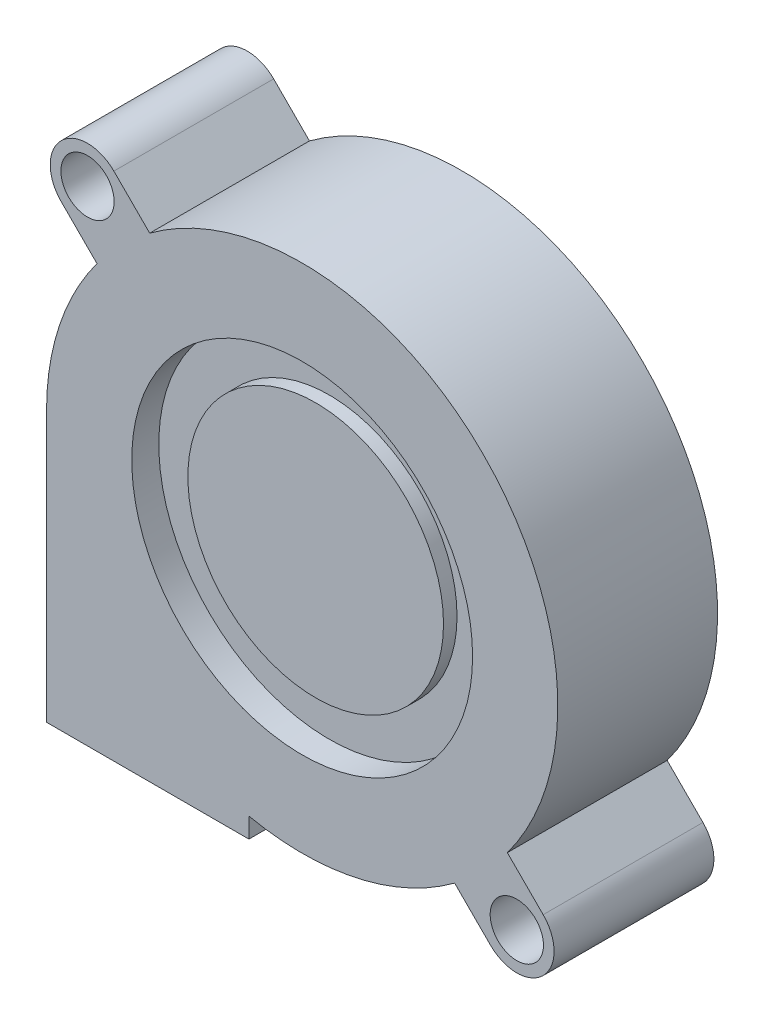
ISO-10303-21;
HEADER;
FILE_DESCRIPTION(('STEP AP214'),'2;1');
FILE_NAME('part.step','',(''),(''),'','','');
FILE_SCHEMA(('AUTOMOTIVE_DESIGN { 1 0 10303 214 1 1 1 1 }'));
ENDSEC;
DATA;
#1=APPLICATION_CONTEXT('core data for automotive mechanical design processes');
#2=APPLICATION_PROTOCOL_DEFINITION('international standard','automotive_design',2000,#1);
#3=PRODUCT_CONTEXT('',#1,'mechanical');
#4=PRODUCT('Part','Part','',(#3));
#5=PRODUCT_RELATED_PRODUCT_CATEGORY('part','',(#4));
#6=PRODUCT_DEFINITION_FORMATION('','',#4);
#7=PRODUCT_DEFINITION_CONTEXT('part definition',#1,'design');
#8=PRODUCT_DEFINITION('design','',#6,#7);
#9=PRODUCT_DEFINITION_SHAPE('','',#8);
#10=(LENGTH_UNIT() NAMED_UNIT(*) SI_UNIT(.MILLI.,.METRE.));
#11=(NAMED_UNIT(*) PLANE_ANGLE_UNIT() SI_UNIT($,.RADIAN.));
#12=(NAMED_UNIT(*) SI_UNIT($,.STERADIAN.) SOLID_ANGLE_UNIT());
#13=UNCERTAINTY_MEASURE_WITH_UNIT(LENGTH_MEASURE(1.E-05),#10,'distance_accuracy_value','');
#14=(GEOMETRIC_REPRESENTATION_CONTEXT(3) GLOBAL_UNCERTAINTY_ASSIGNED_CONTEXT((#13)) GLOBAL_UNIT_ASSIGNED_CONTEXT((#10,
#11,#12)) REPRESENTATION_CONTEXT('',''));
#15=CARTESIAN_POINT('',(0.,0.,0.));
#16=DIRECTION('',(0.,0.,1.));
#17=DIRECTION('',(1.,0.,0.));
#18=AXIS2_PLACEMENT_3D('',#15,#16,#17);
#19=CARTESIAN_POINT('',(0.,0.,12.46));
#20=DIRECTION('',(0.,0.,1.));
#21=DIRECTION('',(1.,0.,0.));
#22=AXIS2_PLACEMENT_3D('',#19,#20,#21);
#23=CYLINDRICAL_SURFACE('',#22,12.);
#24=CARTESIAN_POINT('',(0.,0.,12.46));
#25=DIRECTION('',(0.,0.,1.));
#26=DIRECTION('',(1.,0.,0.));
#27=AXIS2_PLACEMENT_3D('',#24,#25,#26);
#28=CIRCLE('',#27,12.);
#29=CARTESIAN_POINT('',(12.,0.,12.46));
#30=VERTEX_POINT('',#29);
#31=EDGE_CURVE('E314',#30,#30,#28,.T.);
#32=CARTESIAN_POINT('',(0.,0.,13.73));
#33=DIRECTION('',(0.,0.,1.));
#34=DIRECTION('',(1.,0.,0.));
#35=AXIS2_PLACEMENT_3D('',#32,#33,#34);
#36=CIRCLE('',#35,12.);
#37=CARTESIAN_POINT('',(12.,0.,13.73));
#38=VERTEX_POINT('',#37);
#39=EDGE_CURVE('E319',#38,#38,#36,.T.);
#40=CARTESIAN_POINT('',(12.,0.,12.46));
#41=CARTESIAN_POINT('',(12.,0.,12.4732291666667));
#42=CARTESIAN_POINT('',(12.,0.,12.4864583333333));
#43=CARTESIAN_POINT('',(12.,0.,12.5129166666667));
#44=CARTESIAN_POINT('',(12.,0.,12.5261458333333));
#45=CARTESIAN_POINT('',(12.,0.,12.5526041666667));
#46=CARTESIAN_POINT('',(12.,0.,12.5658333333333));
#47=CARTESIAN_POINT('',(12.,0.,12.5922916666667));
#48=CARTESIAN_POINT('',(12.,0.,12.6055208333333));
#49=CARTESIAN_POINT('',(12.,0.,12.6319791666667));
#50=CARTESIAN_POINT('',(12.,0.,12.6452083333333));
#51=CARTESIAN_POINT('',(12.,0.,12.6716666666667));
#52=CARTESIAN_POINT('',(12.,0.,12.6848958333333));
#53=CARTESIAN_POINT('',(12.,0.,12.7113541666667));
#54=CARTESIAN_POINT('',(12.,0.,12.7245833333333));
#55=CARTESIAN_POINT('',(12.,0.,12.7510416666667));
#56=CARTESIAN_POINT('',(12.,0.,12.7642708333333));
#57=CARTESIAN_POINT('',(12.,0.,12.7907291666667));
#58=CARTESIAN_POINT('',(12.,0.,12.8039583333333));
#59=CARTESIAN_POINT('',(12.,0.,12.8304166666667));
#60=CARTESIAN_POINT('',(12.,0.,12.8436458333333));
#61=CARTESIAN_POINT('',(12.,0.,12.8701041666667));
#62=CARTESIAN_POINT('',(12.,0.,12.8833333333333));
#63=CARTESIAN_POINT('',(12.,0.,12.9097916666667));
#64=CARTESIAN_POINT('',(12.,0.,12.9230208333333));
#65=CARTESIAN_POINT('',(12.,0.,12.9494791666667));
#66=CARTESIAN_POINT('',(12.,0.,12.9627083333333));
#67=CARTESIAN_POINT('',(12.,0.,12.9891666666667));
#68=CARTESIAN_POINT('',(12.,0.,13.0023958333333));
#69=CARTESIAN_POINT('',(12.,0.,13.0288541666667));
#70=CARTESIAN_POINT('',(12.,0.,13.0420833333333));
#71=CARTESIAN_POINT('',(12.,0.,13.0685416666667));
#72=CARTESIAN_POINT('',(12.,0.,13.0817708333333));
#73=CARTESIAN_POINT('',(12.,0.,13.1082291666667));
#74=CARTESIAN_POINT('',(12.,0.,13.1214583333333));
#75=CARTESIAN_POINT('',(12.,0.,13.1479166666667));
#76=CARTESIAN_POINT('',(12.,0.,13.1611458333333));
#77=CARTESIAN_POINT('',(12.,0.,13.1876041666667));
#78=CARTESIAN_POINT('',(12.,0.,13.2008333333333));
#79=CARTESIAN_POINT('',(12.,0.,13.2272916666667));
#80=CARTESIAN_POINT('',(12.,0.,13.2405208333333));
#81=CARTESIAN_POINT('',(12.,0.,13.2669791666667));
#82=CARTESIAN_POINT('',(12.,0.,13.2802083333333));
#83=CARTESIAN_POINT('',(12.,0.,13.3066666666667));
#84=CARTESIAN_POINT('',(12.,0.,13.3198958333333));
#85=CARTESIAN_POINT('',(12.,0.,13.3463541666667));
#86=CARTESIAN_POINT('',(12.,0.,13.3595833333333));
#87=CARTESIAN_POINT('',(12.,0.,13.3860416666667));
#88=CARTESIAN_POINT('',(12.,0.,13.3992708333333));
#89=CARTESIAN_POINT('',(12.,0.,13.4257291666667));
#90=CARTESIAN_POINT('',(12.,0.,13.4389583333333));
#91=CARTESIAN_POINT('',(12.,0.,13.4654166666667));
#92=CARTESIAN_POINT('',(12.,0.,13.4786458333333));
#93=CARTESIAN_POINT('',(12.,0.,13.5051041666667));
#94=CARTESIAN_POINT('',(12.,0.,13.5183333333333));
#95=CARTESIAN_POINT('',(12.,0.,13.5447916666667));
#96=CARTESIAN_POINT('',(12.,0.,13.5580208333333));
#97=CARTESIAN_POINT('',(12.,0.,13.5844791666667));
#98=CARTESIAN_POINT('',(12.,0.,13.5977083333333));
#99=CARTESIAN_POINT('',(12.,0.,13.6241666666667));
#100=CARTESIAN_POINT('',(12.,0.,13.6373958333333));
#101=CARTESIAN_POINT('',(12.,0.,13.6638541666667));
#102=CARTESIAN_POINT('',(12.,0.,13.6770833333333));
#103=CARTESIAN_POINT('',(12.,0.,13.7035416666667));
#104=CARTESIAN_POINT('',(12.,0.,13.7167708333333));
#105=CARTESIAN_POINT('',(12.,0.,13.73));
#106=B_SPLINE_CURVE_WITH_KNOTS('',3,(#40,#41,#42,#43,#44,#45,#46,#47,#48,#49,#50,#51,#52,#53,
#54,#55,#56,#57,#58,#59,#60,#61,#62,#63,#64,#65,#66,#67,#68,#69,#70,#71,#72,#73,#74,#75,#76,#77,
#78,#79,#80,#81,#82,#83,#84,#85,#86,#87,#88,#89,#90,#91,#92,#93,#94,#95,#96,#97,#98,#99,#100,
#101,#102,#103,#104,#105),.UNSPECIFIED.,.F.,.F.,(4,2,2,2,2,2,2,2,2,2,2,2,2,2,2,2,2,2,2,2,2,2,2,
2,2,2,2,2,2,2,2,2,4),(0.,0.0396874999999998,0.0793749999999996,0.119062499999999,
0.158749999999999,0.198437499999999,0.238124999999999,0.277812499999999,0.317499999999998,
0.357187499999998,0.396874999999998,0.436562499999998,0.476249999999998,0.515937499999997,
0.555624999999997,0.595312499999997,0.634999999999997,0.674687499999996,0.714374999999998,
0.754062499999998,0.793749999999998,0.833437499999997,0.873124999999997,0.912812499999997,
0.952499999999997,0.992187499999997,1.031875,1.0715625,1.11125,1.1509375,1.190625,1.2303125,
1.27),.UNSPECIFIED.);
#107=EDGE_CURVE('BSEAM37',#30,#38,#106,.T.);
#108=ORIENTED_EDGE('',*,*,#31,.T.);
#109=ORIENTED_EDGE('',*,*,#39,.F.);
#110=ORIENTED_EDGE('',*,*,#107,.T.);
#111=ORIENTED_EDGE('',*,*,#107,.F.);
#112=EDGE_LOOP('',(#108,#110,#109,#111));
#113=FACE_BOUND('',#112,.T.);
#114=ADVANCED_FACE('F37',(#113),#23,.T.);
#115=CARTESIAN_POINT('',(-20.1525432638166,20.1525432638166,15.));
#116=DIRECTION('',(0.,0.,-1.));
#117=DIRECTION('',(-1.,0.,0.));
#118=AXIS2_PLACEMENT_3D('',#115,#116,#117);
#119=CYLINDRICAL_SURFACE('',#118,3.5);
#120=CARTESIAN_POINT('',(-20.1525432638166,20.1525432638166,0.));
#121=DIRECTION('',(0.,0.,1.));
#122=DIRECTION('',(1.,0.,0.));
#123=AXIS2_PLACEMENT_3D('',#120,#121,#122);
#124=CIRCLE('',#123,3.5);
#125=CARTESIAN_POINT('',(-17.6776695296637,22.6274169979695,0.));
#126=VERTEX_POINT('',#125);
#127=CARTESIAN_POINT('',(-22.6274169979695,17.6776695296637,0.));
#128=VERTEX_POINT('',#127);
#129=EDGE_CURVE('E177',#126,#128,#124,.T.);
#130=ORIENTED_EDGE('',*,*,#129,.T.);
#131=DIRECTION('',(0.,0.,-1.));
#132=VECTOR('',#131,1.);
#133=CARTESIAN_POINT('',(-22.6274169979695,17.6776695296637,15.));
#134=LINE('',#133,#132);
#135=CARTESIAN_POINT('',(-22.6274169979695,17.6776695296637,15.));
#136=VERTEX_POINT('',#135);
#137=EDGE_CURVE('E11',#136,#128,#134,.T.);
#138=ORIENTED_EDGE('',*,*,#137,.F.);
#139=CARTESIAN_POINT('',(-20.1525432638166,20.1525432638166,15.));
#140=DIRECTION('',(0.,0.,1.));
#141=DIRECTION('',(1.,0.,0.));
#142=AXIS2_PLACEMENT_3D('',#139,#140,#141);
#143=CIRCLE('',#142,3.5);
#144=CARTESIAN_POINT('',(-17.6776695296637,22.6274169979695,15.));
#145=VERTEX_POINT('',#144);
#146=EDGE_CURVE('E207',#145,#136,#143,.T.);
#147=ORIENTED_EDGE('',*,*,#146,.F.);
#148=DIRECTION('',(0.,0.,-1.));
#149=VECTOR('',#148,1.);
#150=CARTESIAN_POINT('',(-17.6776695296637,22.6274169979695,15.));
#151=LINE('',#150,#149);
#152=EDGE_CURVE('E176',#145,#126,#151,.T.);
#153=ORIENTED_EDGE('',*,*,#152,.T.);
#154=EDGE_LOOP('',(#130,#138,#147,#153));
#155=FACE_BOUND('',#154,.T.);
#156=ADVANCED_FACE('F39',(#155),#119,.T.);
#157=CARTESIAN_POINT('',(-2.47487373415292,-2.47487373415292,15.));
#158=DIRECTION('',(0.707106781186547,0.707106781186547,0.));
#159=DIRECTION('',(-0.707106781186548,0.707106781186548,0.));
#160=AXIS2_PLACEMENT_3D('',#157,#158,#159);
#161=PLANE('',#160);
#162=DIRECTION('',(0.707106781186548,-0.707106781186548,0.));
#163=VECTOR('',#162,1.);
#164=CARTESIAN_POINT('',(-2.47487373415292,-2.47487373415292,0.));
#165=LINE('',#164,#163);
#166=CARTESIAN_POINT('',(-19.2640071245337,14.3142596562279,0.));
#167=VERTEX_POINT('',#166);
#168=EDGE_CURVE('E180',#128,#167,#165,.T.);
#169=ORIENTED_EDGE('',*,*,#168,.T.);
#170=DIRECTION('',(0.,0.,-1.));
#171=VECTOR('',#170,1.);
#172=CARTESIAN_POINT('',(-19.2640071245337,14.3142596562279,15.));
#173=LINE('',#172,#171);
#174=CARTESIAN_POINT('',(-19.2640071245337,14.3142596562279,15.));
#175=VERTEX_POINT('',#174);
#176=EDGE_CURVE('E45',#175,#167,#173,.T.);
#177=ORIENTED_EDGE('',*,*,#176,.F.);
#178=DIRECTION('',(0.707106781186548,-0.707106781186548,0.));
#179=VECTOR('',#178,1.);
#180=CARTESIAN_POINT('',(-2.47487373415292,-2.47487373415292,15.));
#181=LINE('',#180,#179);
#182=EDGE_CURVE('E114',#136,#175,#181,.T.);
#183=ORIENTED_EDGE('',*,*,#182,.F.);
#184=ORIENTED_EDGE('',*,*,#137,.T.);
#185=EDGE_LOOP('',(#169,#177,#183,#184));
#186=FACE_BOUND('',#185,.T.);
#187=ADVANCED_FACE('F331',(#186),#161,.F.);
#188=CARTESIAN_POINT('',(0.,0.,15.));
#189=DIRECTION('',(0.,0.,-1.));
#190=DIRECTION('',(-1.,0.,0.));
#191=AXIS2_PLACEMENT_3D('',#188,#189,#190);
#192=CYLINDRICAL_SURFACE('',#191,24.);
#193=CARTESIAN_POINT('',(0.,0.,0.));
#194=DIRECTION('',(0.,0.,1.));
#195=DIRECTION('',(1.,0.,0.));
#196=AXIS2_PLACEMENT_3D('',#193,#194,#195);
#197=CIRCLE('',#196,24.);
#198=CARTESIAN_POINT('',(-24.,0.,0.));
#199=VERTEX_POINT('',#198);
#200=EDGE_CURVE('E183',#167,#199,#197,.T.);
#201=ORIENTED_EDGE('',*,*,#200,.T.);
#202=DIRECTION('',(0.,0.,-1.));
#203=VECTOR('',#202,1.);
#204=CARTESIAN_POINT('',(-24.,0.,15.));
#205=LINE('',#204,#203);
#206=CARTESIAN_POINT('',(-24.,0.,15.));
#207=VERTEX_POINT('',#206);
#208=EDGE_CURVE('E226',#207,#199,#205,.T.);
#209=ORIENTED_EDGE('',*,*,#208,.F.);
#210=CARTESIAN_POINT('',(0.,0.,15.));
#211=DIRECTION('',(0.,0.,1.));
#212=DIRECTION('',(1.,0.,0.));
#213=AXIS2_PLACEMENT_3D('',#210,#211,#212);
#214=CIRCLE('',#213,24.);
#215=EDGE_CURVE('E234',#175,#207,#214,.T.);
#216=ORIENTED_EDGE('',*,*,#215,.F.);
#217=ORIENTED_EDGE('',*,*,#176,.T.);
#218=EDGE_LOOP('',(#201,#209,#216,#217));
#219=FACE_BOUND('',#218,.T.);
#220=ADVANCED_FACE('F232',(#219),#192,.T.);
#221=CARTESIAN_POINT('',(-24.,0.,15.));
#222=DIRECTION('',(1.,0.,0.));
#223=DIRECTION('',(0.,1.,0.));
#224=AXIS2_PLACEMENT_3D('',#221,#222,#223);
#225=PLANE('',#224);
#226=DIRECTION('',(0.,-1.,0.));
#227=VECTOR('',#226,1.);
#228=CARTESIAN_POINT('',(-24.,0.,0.));
#229=LINE('',#228,#227);
#230=CARTESIAN_POINT('',(-24.,-25.3474567361834,0.));
#231=VERTEX_POINT('',#230);
#232=EDGE_CURVE('E185',#199,#231,#229,.T.);
#233=ORIENTED_EDGE('',*,*,#232,.T.);
#234=DIRECTION('',(0.,0.,-1.));
#235=VECTOR('',#234,1.);
#236=CARTESIAN_POINT('',(-24.,-25.3474567361834,15.));
#237=LINE('',#236,#235);
#238=CARTESIAN_POINT('',(-24.,-25.3474567361834,15.));
#239=VERTEX_POINT('',#238);
#240=EDGE_CURVE('E223',#239,#231,#237,.T.);
#241=ORIENTED_EDGE('',*,*,#240,.F.);
#242=DIRECTION('',(0.,-1.,0.));
#243=VECTOR('',#242,1.);
#244=CARTESIAN_POINT('',(-24.,0.,15.));
#245=LINE('',#244,#243);
#246=EDGE_CURVE('E253',#207,#239,#245,.T.);
#247=ORIENTED_EDGE('',*,*,#246,.F.);
#248=ORIENTED_EDGE('',*,*,#208,.T.);
#249=EDGE_LOOP('',(#233,#241,#247,#248));
#250=FACE_BOUND('',#249,.T.);
#251=ADVANCED_FACE('F244',(#250),#225,.F.);
#252=CARTESIAN_POINT('',(0.,-25.3474567361834,15.));
#253=DIRECTION('',(0.,1.,0.));
#254=DIRECTION('',(0.,0.,1.));
#255=AXIS2_PLACEMENT_3D('',#252,#253,#254);
#256=PLANE('',#255);
#257=DIRECTION('',(0.,0.,1.));
#258=VECTOR('',#257,1.);
#259=CARTESIAN_POINT('',(-6.2,-25.3474567361834,0.));
#260=LINE('',#259,#258);
#261=CARTESIAN_POINT('',(-6.2,-25.3474567361834,1.2));
#262=VERTEX_POINT('',#261);
#263=CARTESIAN_POINT('',(-6.2,-25.3474567361834,13.8));
#264=VERTEX_POINT('',#263);
#265=EDGE_CURVE('E296',#262,#264,#260,.T.);
#266=ORIENTED_EDGE('',*,*,#265,.F.);
#267=DIRECTION('',(1.,0.,0.));
#268=VECTOR('',#267,1.);
#269=CARTESIAN_POINT('',(0.,-25.3474567361834,1.2));
#270=LINE('',#269,#268);
#271=CARTESIAN_POINT('',(-22.8,-25.3474567361834,1.2));
#272=VERTEX_POINT('',#271);
#273=EDGE_CURVE('E52',#272,#262,#270,.T.);
#274=ORIENTED_EDGE('',*,*,#273,.F.);
#275=DIRECTION('',(0.,0.,-1.));
#276=VECTOR('',#275,1.);
#277=CARTESIAN_POINT('',(-22.8,-25.3474567361834,0.));
#278=LINE('',#277,#276);
#279=CARTESIAN_POINT('',(-22.8,-25.3474567361834,13.8));
#280=VERTEX_POINT('',#279);
#281=EDGE_CURVE('E289',#280,#272,#278,.T.);
#282=ORIENTED_EDGE('',*,*,#281,.F.);
#283=DIRECTION('',(-1.,0.,0.));
#284=VECTOR('',#283,1.);
#285=CARTESIAN_POINT('',(0.,-25.3474567361834,13.8));
#286=LINE('',#285,#284);
#287=EDGE_CURVE('E293',#264,#280,#286,.T.);
#288=ORIENTED_EDGE('',*,*,#287,.F.);
#289=EDGE_LOOP('',(#266,#274,#282,#288));
#290=FACE_BOUND('',#289,.T.);
#291=DIRECTION('',(1.,0.,0.));
#292=VECTOR('',#291,1.);
#293=CARTESIAN_POINT('',(0.,-25.3474567361834,0.));
#294=LINE('',#293,#292);
#295=CARTESIAN_POINT('',(-5.,-25.3474567361834,0.));
#296=VERTEX_POINT('',#295);
#297=EDGE_CURVE('E187',#231,#296,#294,.T.);
#298=ORIENTED_EDGE('',*,*,#297,.T.);
#299=DIRECTION('',(0.,0.,-1.));
#300=VECTOR('',#299,1.);
#301=CARTESIAN_POINT('',(-5.,-25.3474567361834,15.));
#302=LINE('',#301,#300);
#303=CARTESIAN_POINT('',(-5.,-25.3474567361834,15.));
#304=VERTEX_POINT('',#303);
#305=EDGE_CURVE('E220',#304,#296,#302,.T.);
#306=ORIENTED_EDGE('',*,*,#305,.F.);
#307=DIRECTION('',(1.,0.,0.));
#308=VECTOR('',#307,1.);
#309=CARTESIAN_POINT('',(0.,-25.3474567361834,15.));
#310=LINE('',#309,#308);
#311=EDGE_CURVE('E250',#239,#304,#310,.T.);
#312=ORIENTED_EDGE('',*,*,#311,.F.);
#313=ORIENTED_EDGE('',*,*,#240,.T.);
#314=EDGE_LOOP('',(#298,#306,#312,#313));
#315=FACE_BOUND('',#314,.T.);
#316=ADVANCED_FACE('F248',(#290,#315),#256,.F.);
#317=CARTESIAN_POINT('',(-5.,0.,15.));
#318=DIRECTION('',(-1.,0.,0.));
#319=DIRECTION('',(0.,0.,1.));
#320=AXIS2_PLACEMENT_3D('',#317,#318,#319);
#321=PLANE('',#320);
#322=DIRECTION('',(0.,1.,0.));
#323=VECTOR('',#322,1.);
#324=CARTESIAN_POINT('',(-5.,0.,0.));
#325=LINE('',#324,#323);
#326=CARTESIAN_POINT('',(-5.,-23.473389188611,0.));
#327=VERTEX_POINT('',#326);
#328=EDGE_CURVE('E189',#296,#327,#325,.T.);
#329=ORIENTED_EDGE('',*,*,#328,.T.);
#330=DIRECTION('',(0.,0.,-1.));
#331=VECTOR('',#330,1.);
#332=CARTESIAN_POINT('',(-5.,-23.473389188611,15.));
#333=LINE('',#332,#331);
#334=CARTESIAN_POINT('',(-5.,-23.473389188611,15.));
#335=VERTEX_POINT('',#334);
#336=EDGE_CURVE('E217',#335,#327,#333,.T.);
#337=ORIENTED_EDGE('',*,*,#336,.F.);
#338=DIRECTION('',(0.,1.,0.));
#339=VECTOR('',#338,1.);
#340=CARTESIAN_POINT('',(-5.,0.,15.));
#341=LINE('',#340,#339);
#342=EDGE_CURVE('E252',#304,#335,#341,.T.);
#343=ORIENTED_EDGE('',*,*,#342,.F.);
#344=ORIENTED_EDGE('',*,*,#305,.T.);
#345=EDGE_LOOP('',(#329,#337,#343,#344));
#346=FACE_BOUND('',#345,.T.);
#347=ADVANCED_FACE('F387',(#346),#321,.F.);
#348=CARTESIAN_POINT('',(0.,0.,15.));
#349=DIRECTION('',(0.,0.,-1.));
#350=DIRECTION('',(-1.,0.,0.));
#351=AXIS2_PLACEMENT_3D('',#348,#349,#350);
#352=CYLINDRICAL_SURFACE('',#351,24.);
#353=CARTESIAN_POINT('',(0.,0.,0.));
#354=DIRECTION('',(0.,0.,1.));
#355=DIRECTION('',(1.,0.,0.));
#356=AXIS2_PLACEMENT_3D('',#353,#354,#355);
#357=CIRCLE('',#356,24.);
#358=CARTESIAN_POINT('',(14.3142596562279,-19.2640071245337,0.));
#359=VERTEX_POINT('',#358);
#360=EDGE_CURVE('E191',#327,#359,#357,.T.);
#361=ORIENTED_EDGE('',*,*,#360,.T.);
#362=DIRECTION('',(0.,0.,-1.));
#363=VECTOR('',#362,1.);
#364=CARTESIAN_POINT('',(14.3142596562279,-19.2640071245337,15.));
#365=LINE('',#364,#363);
#366=CARTESIAN_POINT('',(14.3142596562279,-19.2640071245337,15.));
#367=VERTEX_POINT('',#366);
#368=EDGE_CURVE('E214',#367,#359,#365,.T.);
#369=ORIENTED_EDGE('',*,*,#368,.F.);
#370=CARTESIAN_POINT('',(0.,0.,15.));
#371=DIRECTION('',(0.,0.,1.));
#372=DIRECTION('',(1.,0.,0.));
#373=AXIS2_PLACEMENT_3D('',#370,#371,#372);
#374=CIRCLE('',#373,24.);
#375=EDGE_CURVE('E255',#335,#367,#374,.T.);
#376=ORIENTED_EDGE('',*,*,#375,.F.);
#377=ORIENTED_EDGE('',*,*,#336,.T.);
#378=EDGE_LOOP('',(#361,#369,#376,#377));
#379=FACE_BOUND('',#378,.T.);
#380=ADVANCED_FACE('F384',(#379),#352,.T.);
#381=CARTESIAN_POINT('',(-2.47487373415292,-2.47487373415292,15.));
#382=DIRECTION('',(0.707106781186547,0.707106781186547,0.));
#383=DIRECTION('',(-0.707106781186548,0.707106781186548,0.));
#384=AXIS2_PLACEMENT_3D('',#381,#382,#383);
#385=PLANE('',#384);
#386=DIRECTION('',(0.707106781186548,-0.707106781186548,0.));
#387=VECTOR('',#386,1.);
#388=CARTESIAN_POINT('',(-2.47487373415292,-2.47487373415292,0.));
#389=LINE('',#388,#387);
#390=CARTESIAN_POINT('',(17.6776695296637,-22.6274169979695,0.));
#391=VERTEX_POINT('',#390);
#392=EDGE_CURVE('E193',#359,#391,#389,.T.);
#393=ORIENTED_EDGE('',*,*,#392,.T.);
#394=DIRECTION('',(0.,0.,-1.));
#395=VECTOR('',#394,1.);
#396=CARTESIAN_POINT('',(17.6776695296637,-22.6274169979695,15.));
#397=LINE('',#396,#395);
#398=CARTESIAN_POINT('',(17.6776695296637,-22.6274169979695,15.));
#399=VERTEX_POINT('',#398);
#400=EDGE_CURVE('E211',#399,#391,#397,.T.);
#401=ORIENTED_EDGE('',*,*,#400,.F.);
#402=DIRECTION('',(0.707106781186548,-0.707106781186548,0.));
#403=VECTOR('',#402,1.);
#404=CARTESIAN_POINT('',(-2.47487373415292,-2.47487373415292,15.));
#405=LINE('',#404,#403);
#406=EDGE_CURVE('E261',#367,#399,#405,.T.);
#407=ORIENTED_EDGE('',*,*,#406,.F.);
#408=ORIENTED_EDGE('',*,*,#368,.T.);
#409=EDGE_LOOP('',(#393,#401,#407,#408));
#410=FACE_BOUND('',#409,.T.);
#411=ADVANCED_FACE('F267',(#410),#385,.F.);
#412=CARTESIAN_POINT('',(20.1525432638166,-20.1525432638166,15.));
#413=DIRECTION('',(0.,0.,-1.));
#414=DIRECTION('',(-1.,0.,0.));
#415=AXIS2_PLACEMENT_3D('',#412,#413,#414);
#416=CYLINDRICAL_SURFACE('',#415,3.5);
#417=CARTESIAN_POINT('',(20.1525432638166,-20.1525432638166,0.));
#418=DIRECTION('',(0.,0.,1.));
#419=DIRECTION('',(1.,0.,0.));
#420=AXIS2_PLACEMENT_3D('',#417,#418,#419);
#421=CIRCLE('',#420,3.5);
#422=CARTESIAN_POINT('',(22.6274169979695,-17.6776695296637,0.));
#423=VERTEX_POINT('',#422);
#424=EDGE_CURVE('E195',#391,#423,#421,.T.);
#425=ORIENTED_EDGE('',*,*,#424,.T.);
#426=DIRECTION('',(0.,0.,-1.));
#427=VECTOR('',#426,1.);
#428=CARTESIAN_POINT('',(22.6274169979695,-17.6776695296637,15.));
#429=LINE('',#428,#427);
#430=CARTESIAN_POINT('',(22.6274169979695,-17.6776695296637,15.));
#431=VERTEX_POINT('',#430);
#432=EDGE_CURVE('E162',#431,#423,#429,.T.);
#433=ORIENTED_EDGE('',*,*,#432,.F.);
#434=CARTESIAN_POINT('',(20.1525432638166,-20.1525432638166,15.));
#435=DIRECTION('',(0.,0.,1.));
#436=DIRECTION('',(1.,0.,0.));
#437=AXIS2_PLACEMENT_3D('',#434,#435,#436);
#438=CIRCLE('',#437,3.5);
#439=EDGE_CURVE('E150',#399,#431,#438,.T.);
#440=ORIENTED_EDGE('',*,*,#439,.F.);
#441=ORIENTED_EDGE('',*,*,#400,.T.);
#442=EDGE_LOOP('',(#425,#433,#440,#441));
#443=FACE_BOUND('',#442,.T.);
#444=ADVANCED_FACE('F271',(#443),#416,.T.);
#445=CARTESIAN_POINT('',(2.47487373415291,2.47487373415291,15.));
#446=DIRECTION('',(-0.707106781186547,-0.707106781186547,0.));
#447=DIRECTION('',(0.707106781186548,-0.707106781186548,0.));
#448=AXIS2_PLACEMENT_3D('',#445,#446,#447);
#449=PLANE('',#448);
#450=DIRECTION('',(-0.707106781186548,0.707106781186548,0.));
#451=VECTOR('',#450,1.);
#452=CARTESIAN_POINT('',(2.47487373415291,2.47487373415291,0.));
#453=LINE('',#452,#451);
#454=CARTESIAN_POINT('',(19.2640071245337,-14.3142596562279,0.));
#455=VERTEX_POINT('',#454);
#456=EDGE_CURVE('E159',#423,#455,#453,.T.);
#457=ORIENTED_EDGE('',*,*,#456,.T.);
#458=DIRECTION('',(0.,0.,-1.));
#459=VECTOR('',#458,1.);
#460=CARTESIAN_POINT('',(19.2640071245337,-14.3142596562279,15.));
#461=LINE('',#460,#459);
#462=CARTESIAN_POINT('',(19.2640071245337,-14.3142596562279,15.));
#463=VERTEX_POINT('',#462);
#464=EDGE_CURVE('E156',#463,#455,#461,.T.);
#465=ORIENTED_EDGE('',*,*,#464,.F.);
#466=DIRECTION('',(-0.707106781186548,0.707106781186548,0.));
#467=VECTOR('',#466,1.);
#468=CARTESIAN_POINT('',(2.47487373415291,2.47487373415291,15.));
#469=LINE('',#468,#467);
#470=EDGE_CURVE('E142',#431,#463,#469,.T.);
#471=ORIENTED_EDGE('',*,*,#470,.F.);
#472=ORIENTED_EDGE('',*,*,#432,.T.);
#473=EDGE_LOOP('',(#457,#465,#471,#472));
#474=FACE_BOUND('',#473,.T.);
#475=ADVANCED_FACE('F157',(#474),#449,.F.);
#476=CARTESIAN_POINT('',(0.,0.,15.));
#477=DIRECTION('',(0.,0.,-1.));
#478=DIRECTION('',(-1.,0.,0.));
#479=AXIS2_PLACEMENT_3D('',#476,#477,#478);
#480=CYLINDRICAL_SURFACE('',#479,24.);
#481=CARTESIAN_POINT('',(0.,0.,0.));
#482=DIRECTION('',(0.,0.,1.));
#483=DIRECTION('',(1.,0.,0.));
#484=AXIS2_PLACEMENT_3D('',#481,#482,#483);
#485=CIRCLE('',#484,24.);
#486=CARTESIAN_POINT('',(-14.3142596562279,19.2640071245337,0.));
#487=VERTEX_POINT('',#486);
#488=EDGE_CURVE('E198',#455,#487,#485,.T.);
#489=ORIENTED_EDGE('',*,*,#488,.T.);
#490=DIRECTION('',(0.,0.,-1.));
#491=VECTOR('',#490,1.);
#492=CARTESIAN_POINT('',(-14.3142596562279,19.2640071245337,15.));
#493=LINE('',#492,#491);
#494=CARTESIAN_POINT('',(-14.3142596562279,19.2640071245337,15.));
#495=VERTEX_POINT('',#494);
#496=EDGE_CURVE('E163',#495,#487,#493,.T.);
#497=ORIENTED_EDGE('',*,*,#496,.F.);
#498=CARTESIAN_POINT('',(0.,0.,15.));
#499=DIRECTION('',(0.,0.,1.));
#500=DIRECTION('',(1.,0.,0.));
#501=AXIS2_PLACEMENT_3D('',#498,#499,#500);
#502=CIRCLE('',#501,24.);
#503=EDGE_CURVE('E147',#463,#495,#502,.T.);
#504=ORIENTED_EDGE('',*,*,#503,.F.);
#505=ORIENTED_EDGE('',*,*,#464,.T.);
#506=EDGE_LOOP('',(#489,#497,#504,#505));
#507=FACE_BOUND('',#506,.T.);
#508=ADVANCED_FACE('F165',(#507),#480,.T.);
#509=CARTESIAN_POINT('',(-20.1525432638166,20.1525432638166,15.));
#510=DIRECTION('',(0.,0.,-1.));
#511=DIRECTION('',(-1.,0.,0.));
#512=AXIS2_PLACEMENT_3D('',#509,#510,#511);
#513=CYLINDRICAL_SURFACE('',#512,2.5);
#514=CARTESIAN_POINT('',(-20.1525432638166,20.1525432638166,15.));
#515=DIRECTION('',(0.,0.,1.));
#516=DIRECTION('',(1.,0.,0.));
#517=AXIS2_PLACEMENT_3D('',#514,#515,#516);
#518=CIRCLE('',#517,2.5);
#519=CARTESIAN_POINT('',(-17.6525432638166,20.1525432638166,15.));
#520=VERTEX_POINT('',#519);
#521=EDGE_CURVE('E167',#520,#520,#518,.T.);
#522=ORIENTED_EDGE('',*,*,#521,.T.);
#523=EDGE_LOOP('',(#522));
#524=FACE_BOUND('',#523,.T.);
#525=CARTESIAN_POINT('',(-20.1525432638166,20.1525432638166,0.));
#526=DIRECTION('',(0.,0.,1.));
#527=DIRECTION('',(1.,0.,0.));
#528=AXIS2_PLACEMENT_3D('',#525,#526,#527);
#529=CIRCLE('',#528,2.5);
#530=CARTESIAN_POINT('',(-17.6525432638166,20.1525432638166,0.));
#531=VERTEX_POINT('',#530);
#532=EDGE_CURVE('E201',#531,#531,#529,.T.);
#533=ORIENTED_EDGE('',*,*,#532,.F.);
#534=EDGE_LOOP('',(#533));
#535=FACE_BOUND('',#534,.T.);
#536=ADVANCED_FACE('F370',(#524,#535),#513,.F.);
#537=CARTESIAN_POINT('',(2.47487373415291,2.47487373415291,15.));
#538=DIRECTION('',(-0.707106781186547,-0.707106781186547,0.));
#539=DIRECTION('',(0.707106781186548,-0.707106781186548,0.));
#540=AXIS2_PLACEMENT_3D('',#537,#538,#539);
#541=PLANE('',#540);
#542=DIRECTION('',(-0.707106781186548,0.707106781186548,0.));
#543=VECTOR('',#542,1.);
#544=CARTESIAN_POINT('',(2.47487373415291,2.47487373415291,0.));
#545=LINE('',#544,#543);
#546=EDGE_CURVE('E106',#487,#126,#545,.T.);
#547=ORIENTED_EDGE('',*,*,#546,.T.);
#548=ORIENTED_EDGE('',*,*,#152,.F.);
#549=DIRECTION('',(-0.707106781186548,0.707106781186548,0.));
#550=VECTOR('',#549,1.);
#551=CARTESIAN_POINT('',(2.47487373415291,2.47487373415291,15.));
#552=LINE('',#551,#550);
#553=EDGE_CURVE('E61',#495,#145,#552,.T.);
#554=ORIENTED_EDGE('',*,*,#553,.F.);
#555=ORIENTED_EDGE('',*,*,#496,.T.);
#556=EDGE_LOOP('',(#547,#548,#554,#555));
#557=FACE_BOUND('',#556,.T.);
#558=ADVANCED_FACE('F272',(#557),#541,.F.);
#559=CARTESIAN_POINT('',(20.1525432638166,-20.1525432638166,15.));
#560=DIRECTION('',(0.,0.,-1.));
#561=DIRECTION('',(-1.,0.,0.));
#562=AXIS2_PLACEMENT_3D('',#559,#560,#561);
#563=CYLINDRICAL_SURFACE('',#562,2.5);
#564=CARTESIAN_POINT('',(20.1525432638166,-20.1525432638166,15.));
#565=DIRECTION('',(0.,0.,1.));
#566=DIRECTION('',(1.,0.,0.));
#567=AXIS2_PLACEMENT_3D('',#564,#565,#566);
#568=CIRCLE('',#567,2.5);
#569=CARTESIAN_POINT('',(22.6525432638166,-20.1525432638166,15.));
#570=VERTEX_POINT('',#569);
#571=EDGE_CURVE('E173',#570,#570,#568,.T.);
#572=ORIENTED_EDGE('',*,*,#571,.T.);
#573=EDGE_LOOP('',(#572));
#574=FACE_BOUND('',#573,.T.);
#575=CARTESIAN_POINT('',(20.1525432638166,-20.1525432638166,0.));
#576=DIRECTION('',(0.,0.,1.));
#577=DIRECTION('',(1.,0.,0.));
#578=AXIS2_PLACEMENT_3D('',#575,#576,#577);
#579=CIRCLE('',#578,2.5);
#580=CARTESIAN_POINT('',(22.6525432638166,-20.1525432638166,0.));
#581=VERTEX_POINT('',#580);
#582=EDGE_CURVE('E204',#581,#581,#579,.T.);
#583=ORIENTED_EDGE('',*,*,#582,.F.);
#584=EDGE_LOOP('',(#583));
#585=FACE_BOUND('',#584,.T.);
#586=ADVANCED_FACE('F363',(#574,#585),#563,.F.);
#587=CARTESIAN_POINT('',(0.,0.,15.));
#588=DIRECTION('',(0.,0.,1.));
#589=DIRECTION('',(1.,0.,0.));
#590=AXIS2_PLACEMENT_3D('',#587,#588,#589);
#591=PLANE('',#590);
#592=CARTESIAN_POINT('',(0.,0.,15.));
#593=DIRECTION('',(0.,0.,1.));
#594=DIRECTION('',(1.,0.,0.));
#595=AXIS2_PLACEMENT_3D('',#592,#593,#594);
#596=CIRCLE('',#595,16.);
#597=CARTESIAN_POINT('',(16.,0.,15.));
#598=VERTEX_POINT('',#597);
#599=EDGE_CURVE('E311',#598,#598,#596,.T.);
#600=ORIENTED_EDGE('',*,*,#599,.F.);
#601=EDGE_LOOP('',(#600));
#602=FACE_BOUND('',#601,.T.);
#603=ORIENTED_EDGE('',*,*,#146,.T.);
#604=ORIENTED_EDGE('',*,*,#182,.T.);
#605=ORIENTED_EDGE('',*,*,#215,.T.);
#606=ORIENTED_EDGE('',*,*,#246,.T.);
#607=ORIENTED_EDGE('',*,*,#311,.T.);
#608=ORIENTED_EDGE('',*,*,#342,.T.);
#609=ORIENTED_EDGE('',*,*,#375,.T.);
#610=ORIENTED_EDGE('',*,*,#406,.T.);
#611=ORIENTED_EDGE('',*,*,#439,.T.);
#612=ORIENTED_EDGE('',*,*,#470,.T.);
#613=ORIENTED_EDGE('',*,*,#503,.T.);
#614=ORIENTED_EDGE('',*,*,#553,.T.);
#615=EDGE_LOOP('',(#603,#604,#605,#606,#607,#608,#609,#610,#611,#612,#613,#614));
#616=FACE_BOUND('',#615,.T.);
#617=ORIENTED_EDGE('',*,*,#521,.F.);
#618=EDGE_LOOP('',(#617));
#619=FACE_BOUND('',#618,.T.);
#620=ORIENTED_EDGE('',*,*,#571,.F.);
#621=EDGE_LOOP('',(#620));
#622=FACE_BOUND('',#621,.T.);
#623=ADVANCED_FACE('F144',(#602,#616,#619,#622),#591,.T.);
#624=CARTESIAN_POINT('',(0.,0.,0.));
#625=DIRECTION('',(0.,0.,1.));
#626=DIRECTION('',(1.,0.,0.));
#627=AXIS2_PLACEMENT_3D('',#624,#625,#626);
#628=PLANE('',#627);
#629=ORIENTED_EDGE('',*,*,#129,.F.);
#630=ORIENTED_EDGE('',*,*,#546,.F.);
#631=ORIENTED_EDGE('',*,*,#488,.F.);
#632=ORIENTED_EDGE('',*,*,#456,.F.);
#633=ORIENTED_EDGE('',*,*,#424,.F.);
#634=ORIENTED_EDGE('',*,*,#392,.F.);
#635=ORIENTED_EDGE('',*,*,#360,.F.);
#636=ORIENTED_EDGE('',*,*,#328,.F.);
#637=ORIENTED_EDGE('',*,*,#297,.F.);
#638=ORIENTED_EDGE('',*,*,#232,.F.);
#639=ORIENTED_EDGE('',*,*,#200,.F.);
#640=ORIENTED_EDGE('',*,*,#168,.F.);
#641=EDGE_LOOP('',(#629,#630,#631,#632,#633,#634,#635,#636,#637,#638,#639,#640));
#642=FACE_BOUND('',#641,.T.);
#643=ORIENTED_EDGE('',*,*,#532,.T.);
#644=EDGE_LOOP('',(#643));
#645=FACE_BOUND('',#644,.T.);
#646=ORIENTED_EDGE('',*,*,#582,.T.);
#647=EDGE_LOOP('',(#646));
#648=FACE_BOUND('',#647,.T.);
#649=ADVANCED_FACE('F238',(#642,#645,#648),#628,.F.);
#650=CARTESIAN_POINT('',(0.,-21.3474567361834,1.2));
#651=DIRECTION('',(0.,0.,-1.));
#652=DIRECTION('',(-1.,0.,0.));
#653=AXIS2_PLACEMENT_3D('',#650,#651,#652);
#654=PLANE('',#653);
#655=ORIENTED_EDGE('',*,*,#273,.T.);
#656=DIRECTION('',(0.,-1.,0.));
#657=VECTOR('',#656,1.);
#658=CARTESIAN_POINT('',(-6.2,-21.3474567361834,1.2));
#659=LINE('',#658,#657);
#660=CARTESIAN_POINT('',(-6.2,-21.3474567361834,1.2));
#661=VERTEX_POINT('',#660);
#662=EDGE_CURVE('E279',#661,#262,#659,.T.);
#663=ORIENTED_EDGE('',*,*,#662,.F.);
#664=DIRECTION('',(1.,0.,0.));
#665=VECTOR('',#664,1.);
#666=CARTESIAN_POINT('',(0.,-21.3474567361834,1.2));
#667=LINE('',#666,#665);
#668=CARTESIAN_POINT('',(-22.8,-21.3474567361834,1.2));
#669=VERTEX_POINT('',#668);
#670=EDGE_CURVE('E292',#669,#661,#667,.T.);
#671=ORIENTED_EDGE('',*,*,#670,.F.);
#672=DIRECTION('',(0.,-1.,0.));
#673=VECTOR('',#672,1.);
#674=CARTESIAN_POINT('',(-22.8,-21.3474567361834,1.2));
#675=LINE('',#674,#673);
#676=EDGE_CURVE('E181',#669,#272,#675,.T.);
#677=ORIENTED_EDGE('',*,*,#676,.T.);
#678=EDGE_LOOP('',(#655,#663,#671,#677));
#679=FACE_BOUND('',#678,.T.);
#680=ADVANCED_FACE('F351',(#679),#654,.F.);
#681=CARTESIAN_POINT('',(-22.8,-21.3474567361834,0.));
#682=DIRECTION('',(-1.,0.,0.));
#683=DIRECTION('',(0.,0.,1.));
#684=AXIS2_PLACEMENT_3D('',#681,#682,#683);
#685=PLANE('',#684);
#686=ORIENTED_EDGE('',*,*,#281,.T.);
#687=ORIENTED_EDGE('',*,*,#676,.F.);
#688=DIRECTION('',(0.,0.,-1.));
#689=VECTOR('',#688,1.);
#690=CARTESIAN_POINT('',(-22.8,-21.3474567361834,0.));
#691=LINE('',#690,#689);
#692=CARTESIAN_POINT('',(-22.8,-21.3474567361834,13.8));
#693=VERTEX_POINT('',#692);
#694=EDGE_CURVE('E282',#693,#669,#691,.T.);
#695=ORIENTED_EDGE('',*,*,#694,.F.);
#696=DIRECTION('',(0.,-1.,0.));
#697=VECTOR('',#696,1.);
#698=CARTESIAN_POINT('',(-22.8,-21.3474567361834,13.8));
#699=LINE('',#698,#697);
#700=EDGE_CURVE('E285',#693,#280,#699,.T.);
#701=ORIENTED_EDGE('',*,*,#700,.T.);
#702=EDGE_LOOP('',(#686,#687,#695,#701));
#703=FACE_BOUND('',#702,.T.);
#704=ADVANCED_FACE('F347',(#703),#685,.F.);
#705=CARTESIAN_POINT('',(0.,-21.3474567361834,13.8));
#706=DIRECTION('',(0.,0.,1.));
#707=DIRECTION('',(1.,0.,0.));
#708=AXIS2_PLACEMENT_3D('',#705,#706,#707);
#709=PLANE('',#708);
#710=ORIENTED_EDGE('',*,*,#287,.T.);
#711=ORIENTED_EDGE('',*,*,#700,.F.);
#712=DIRECTION('',(-1.,0.,0.));
#713=VECTOR('',#712,1.);
#714=CARTESIAN_POINT('',(0.,-21.3474567361834,13.8));
#715=LINE('',#714,#713);
#716=CARTESIAN_POINT('',(-6.2,-21.3474567361834,13.8));
#717=VERTEX_POINT('',#716);
#718=EDGE_CURVE('E303',#717,#693,#715,.T.);
#719=ORIENTED_EDGE('',*,*,#718,.F.);
#720=DIRECTION('',(0.,-1.,0.));
#721=VECTOR('',#720,1.);
#722=CARTESIAN_POINT('',(-6.2,-21.3474567361834,13.8));
#723=LINE('',#722,#721);
#724=EDGE_CURVE('E281',#717,#264,#723,.T.);
#725=ORIENTED_EDGE('',*,*,#724,.T.);
#726=EDGE_LOOP('',(#710,#711,#719,#725));
#727=FACE_BOUND('',#726,.T.);
#728=ADVANCED_FACE('F350',(#727),#709,.F.);
#729=CARTESIAN_POINT('',(-6.2,-21.3474567361834,0.));
#730=DIRECTION('',(1.,0.,0.));
#731=DIRECTION('',(0.,0.,-1.));
#732=AXIS2_PLACEMENT_3D('',#729,#730,#731);
#733=PLANE('',#732);
#734=ORIENTED_EDGE('',*,*,#265,.T.);
#735=ORIENTED_EDGE('',*,*,#724,.F.);
#736=DIRECTION('',(0.,0.,1.));
#737=VECTOR('',#736,1.);
#738=CARTESIAN_POINT('',(-6.2,-21.3474567361834,0.));
#739=LINE('',#738,#737);
#740=EDGE_CURVE('E306',#661,#717,#739,.T.);
#741=ORIENTED_EDGE('',*,*,#740,.F.);
#742=ORIENTED_EDGE('',*,*,#662,.T.);
#743=EDGE_LOOP('',(#734,#735,#741,#742));
#744=FACE_BOUND('',#743,.T.);
#745=ADVANCED_FACE('F345',(#744),#733,.F.);
#746=CARTESIAN_POINT('',(0.,-21.3474567361834,0.));
#747=DIRECTION('',(0.,-1.,0.));
#748=DIRECTION('',(0.,0.,-1.));
#749=AXIS2_PLACEMENT_3D('',#746,#747,#748);
#750=PLANE('',#749);
#751=ORIENTED_EDGE('',*,*,#670,.T.);
#752=ORIENTED_EDGE('',*,*,#740,.T.);
#753=ORIENTED_EDGE('',*,*,#718,.T.);
#754=ORIENTED_EDGE('',*,*,#694,.T.);
#755=EDGE_LOOP('',(#751,#752,#753,#754));
#756=FACE_BOUND('',#755,.T.);
#757=ADVANCED_FACE('F341',(#756),#750,.T.);
#758=CARTESIAN_POINT('',(0.,0.,12.46));
#759=DIRECTION('',(0.,0.,1.));
#760=DIRECTION('',(1.,0.,0.));
#761=AXIS2_PLACEMENT_3D('',#758,#759,#760);
#762=CYLINDRICAL_SURFACE('',#761,16.);
#763=CARTESIAN_POINT('',(0.,0.,12.46));
#764=DIRECTION('',(0.,0.,1.));
#765=DIRECTION('',(1.,0.,0.));
#766=AXIS2_PLACEMENT_3D('',#763,#764,#765);
#767=CIRCLE('',#766,16.);
#768=CARTESIAN_POINT('',(16.,0.,12.46));
#769=VERTEX_POINT('',#768);
#770=EDGE_CURVE('E300',#769,#769,#767,.T.);
#771=CARTESIAN_POINT('',(16.,0.,12.46));
#772=CARTESIAN_POINT('',(16.,0.,12.4864583333333));
#773=CARTESIAN_POINT('',(16.,0.,12.5129166666667));
#774=CARTESIAN_POINT('',(16.,0.,12.5658333333333));
#775=CARTESIAN_POINT('',(16.,0.,12.5922916666667));
#776=CARTESIAN_POINT('',(16.,0.,12.6452083333333));
#777=CARTESIAN_POINT('',(16.,0.,12.6716666666667));
#778=CARTESIAN_POINT('',(16.,0.,12.7245833333333));
#779=CARTESIAN_POINT('',(16.,0.,12.7510416666667));
#780=CARTESIAN_POINT('',(16.,0.,12.8039583333333));
#781=CARTESIAN_POINT('',(16.,0.,12.8304166666667));
#782=CARTESIAN_POINT('',(16.,0.,12.8833333333333));
#783=CARTESIAN_POINT('',(16.,0.,12.9097916666667));
#784=CARTESIAN_POINT('',(16.,0.,12.9627083333333));
#785=CARTESIAN_POINT('',(16.,0.,12.9891666666667));
#786=CARTESIAN_POINT('',(16.,0.,13.0420833333333));
#787=CARTESIAN_POINT('',(16.,0.,13.0685416666667));
#788=CARTESIAN_POINT('',(16.,0.,13.1214583333333));
#789=CARTESIAN_POINT('',(16.,0.,13.1479166666667));
#790=CARTESIAN_POINT('',(16.,0.,13.2008333333333));
#791=CARTESIAN_POINT('',(16.,0.,13.2272916666667));
#792=CARTESIAN_POINT('',(16.,0.,13.2802083333333));
#793=CARTESIAN_POINT('',(16.,0.,13.3066666666667));
#794=CARTESIAN_POINT('',(16.,0.,13.3595833333333));
#795=CARTESIAN_POINT('',(16.,0.,13.3860416666667));
#796=CARTESIAN_POINT('',(16.,0.,13.4389583333333));
#797=CARTESIAN_POINT('',(16.,0.,13.4654166666667));
#798=CARTESIAN_POINT('',(16.,0.,13.5183333333333));
#799=CARTESIAN_POINT('',(16.,0.,13.5447916666667));
#800=CARTESIAN_POINT('',(16.,0.,13.5977083333333));
#801=CARTESIAN_POINT('',(16.,0.,13.6241666666667));
#802=CARTESIAN_POINT('',(16.,0.,13.6770833333333));
#803=CARTESIAN_POINT('',(16.,0.,13.7035416666667));
#804=CARTESIAN_POINT('',(16.,0.,13.7564583333333));
#805=CARTESIAN_POINT('',(16.,0.,13.7829166666667));
#806=CARTESIAN_POINT('',(16.,0.,13.8358333333333));
#807=CARTESIAN_POINT('',(16.,0.,13.8622916666667));
#808=CARTESIAN_POINT('',(16.,0.,13.9152083333333));
#809=CARTESIAN_POINT('',(16.,0.,13.9416666666667));
#810=CARTESIAN_POINT('',(16.,0.,13.9945833333333));
#811=CARTESIAN_POINT('',(16.,0.,14.0210416666667));
#812=CARTESIAN_POINT('',(16.,0.,14.0739583333333));
#813=CARTESIAN_POINT('',(16.,0.,14.1004166666667));
#814=CARTESIAN_POINT('',(16.,0.,14.1533333333333));
#815=CARTESIAN_POINT('',(16.,0.,14.1797916666667));
#816=CARTESIAN_POINT('',(16.,0.,14.2327083333333));
#817=CARTESIAN_POINT('',(16.,0.,14.2591666666667));
#818=CARTESIAN_POINT('',(16.,0.,14.3120833333333));
#819=CARTESIAN_POINT('',(16.,0.,14.3385416666667));
#820=CARTESIAN_POINT('',(16.,0.,14.3914583333333));
#821=CARTESIAN_POINT('',(16.,0.,14.4179166666667));
#822=CARTESIAN_POINT('',(16.,0.,14.4708333333333));
#823=CARTESIAN_POINT('',(16.,0.,14.4972916666667));
#824=CARTESIAN_POINT('',(16.,0.,14.5502083333333));
#825=CARTESIAN_POINT('',(16.,0.,14.5766666666667));
#826=CARTESIAN_POINT('',(16.,0.,14.6295833333333));
#827=CARTESIAN_POINT('',(16.,0.,14.6560416666667));
#828=CARTESIAN_POINT('',(16.,0.,14.7089583333333));
#829=CARTESIAN_POINT('',(16.,0.,14.7354166666667));
#830=CARTESIAN_POINT('',(16.,0.,14.7883333333333));
#831=CARTESIAN_POINT('',(16.,0.,14.8147916666667));
#832=CARTESIAN_POINT('',(16.,0.,14.8677083333333));
#833=CARTESIAN_POINT('',(16.,0.,14.8941666666667));
#834=CARTESIAN_POINT('',(16.,0.,14.9470833333333));
#835=CARTESIAN_POINT('',(16.,0.,14.9735416666667));
#836=CARTESIAN_POINT('',(16.,0.,15.));
#837=B_SPLINE_CURVE_WITH_KNOTS('',3,(#771,#772,#773,#774,#775,#776,#777,#778,#779,#780,#781,
#782,#783,#784,#785,#786,#787,#788,#789,#790,#791,#792,#793,#794,#795,#796,#797,#798,#799,#800,
#801,#802,#803,#804,#805,#806,#807,#808,#809,#810,#811,#812,#813,#814,#815,#816,#817,#818,#819,
#820,#821,#822,#823,#824,#825,#826,#827,#828,#829,#830,#831,#832,#833,#834,#835,#836),
.UNSPECIFIED.,.F.,.F.,(4,2,2,2,2,2,2,2,2,2,2,2,2,2,2,2,2,2,2,2,2,2,2,2,2,2,2,2,2,2,2,2,4),(0.,
0.0793749999999996,0.158749999999999,0.238124999999999,0.317499999999998,0.396874999999998,
0.476249999999999,0.555624999999999,0.634999999999998,0.714374999999998,0.793749999999998,
0.873124999999999,0.952499999999998,1.031875,1.11125,1.190625,1.27,1.349375,1.42875,1.508125,
1.5875,1.666875,1.74625,1.825625,1.905,1.984375,2.06375,2.143125,2.2225,2.301875,2.38125,
2.460625,2.54),.UNSPECIFIED.);
#838=EDGE_CURVE('BSEAM337',#769,#598,#837,.T.);
#839=ORIENTED_EDGE('',*,*,#770,.F.);
#840=ORIENTED_EDGE('',*,*,#599,.T.);
#841=ORIENTED_EDGE('',*,*,#838,.T.);
#842=ORIENTED_EDGE('',*,*,#838,.F.);
#843=EDGE_LOOP('',(#839,#841,#840,#842));
#844=FACE_BOUND('',#843,.T.);
#845=ADVANCED_FACE('F337',(#844),#762,.F.);
#846=CARTESIAN_POINT('',(0.,0.,12.46));
#847=DIRECTION('',(0.,0.,1.));
#848=DIRECTION('',(1.,0.,0.));
#849=AXIS2_PLACEMENT_3D('',#846,#847,#848);
#850=PLANE('',#849);
#851=ORIENTED_EDGE('',*,*,#31,.F.);
#852=EDGE_LOOP('',(#851));
#853=FACE_BOUND('',#852,.T.);
#854=ORIENTED_EDGE('',*,*,#770,.T.);
#855=EDGE_LOOP('',(#854));
#856=FACE_BOUND('',#855,.T.);
#857=ADVANCED_FACE('F334',(#853,#856),#850,.T.);
#858=CARTESIAN_POINT('',(0.,0.,13.73));
#859=DIRECTION('',(0.,0.,1.));
#860=DIRECTION('',(1.,0.,0.));
#861=AXIS2_PLACEMENT_3D('',#858,#859,#860);
#862=PLANE('',#861);
#863=ORIENTED_EDGE('',*,*,#39,.T.);
#864=EDGE_LOOP('',(#863));
#865=FACE_BOUND('',#864,.T.);
#866=ADVANCED_FACE('F323',(#865),#862,.T.);
#867=CLOSED_SHELL('',(#114,#156,#187,#220,#251,#316,#347,#380,#411,#444,#475,#508,#536,#558,
#586,#623,#649,#680,#704,#728,#745,#757,#845,#857,#866));
#868=MANIFOLD_SOLID_BREP('B2',#867);
#869=ADVANCED_BREP_SHAPE_REPRESENTATION('',(#18,#868),#14);
#870=SHAPE_DEFINITION_REPRESENTATION(#9,#869);
ENDSEC;
END-ISO-10303-21;
